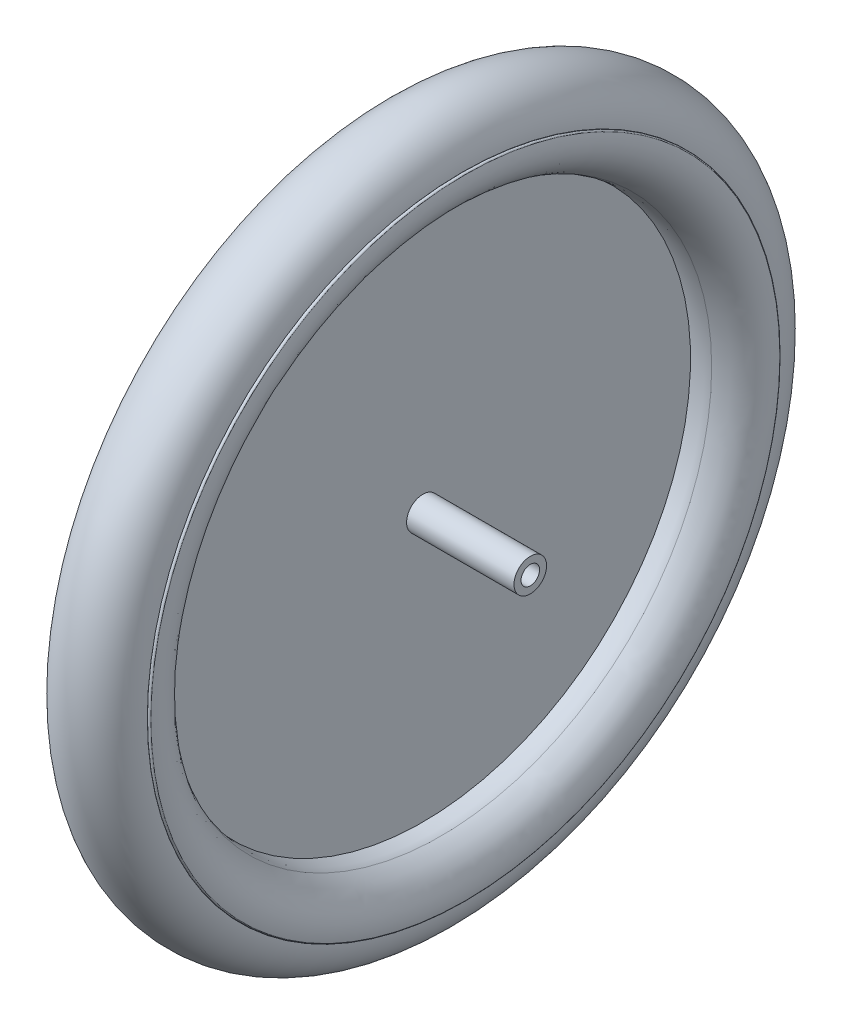
ISO-10303-21;
HEADER;
FILE_DESCRIPTION(('STEP AP214'),'2;1');
FILE_NAME('part.step','',(''),(''),'','','');
FILE_SCHEMA(('AUTOMOTIVE_DESIGN { 1 0 10303 214 1 1 1 1 }'));
ENDSEC;
DATA;
#1=APPLICATION_CONTEXT('core data for automotive mechanical design processes');
#2=APPLICATION_PROTOCOL_DEFINITION('international standard','automotive_design',2000,#1);
#3=PRODUCT_CONTEXT('',#1,'mechanical');
#4=PRODUCT('Part','Part','',(#3));
#5=PRODUCT_RELATED_PRODUCT_CATEGORY('part','',(#4));
#6=PRODUCT_DEFINITION_FORMATION('','',#4);
#7=PRODUCT_DEFINITION_CONTEXT('part definition',#1,'design');
#8=PRODUCT_DEFINITION('design','',#6,#7);
#9=PRODUCT_DEFINITION_SHAPE('','',#8);
#10=(LENGTH_UNIT() NAMED_UNIT(*) SI_UNIT(.MILLI.,.METRE.));
#11=(NAMED_UNIT(*) PLANE_ANGLE_UNIT() SI_UNIT($,.RADIAN.));
#12=(NAMED_UNIT(*) SI_UNIT($,.STERADIAN.) SOLID_ANGLE_UNIT());
#13=UNCERTAINTY_MEASURE_WITH_UNIT(LENGTH_MEASURE(1.E-05),#10,'distance_accuracy_value','');
#14=(GEOMETRIC_REPRESENTATION_CONTEXT(3) GLOBAL_UNCERTAINTY_ASSIGNED_CONTEXT((#13)) GLOBAL_UNIT_ASSIGNED_CONTEXT((#10,
#11,#12)) REPRESENTATION_CONTEXT('',''));
#15=CARTESIAN_POINT('',(0.,0.,0.));
#16=DIRECTION('',(0.,0.,1.));
#17=DIRECTION('',(1.,0.,0.));
#18=AXIS2_PLACEMENT_3D('',#15,#16,#17);
#19=CARTESIAN_POINT('',(-10.6715551842088,146.25842272365,0.));
#20=CARTESIAN_POINT('',(-5.81941817443586,143.971838924294,0.));
#21=CARTESIAN_POINT('',(6.40233055545218,143.852391413271,0.));
#22=CARTESIAN_POINT('',(10.6715551842088,146.25842272365,0.));
#23=B_SPLINE_CURVE_WITH_KNOTS('',3,(#19,#20,#21,#22),.UNSPECIFIED.,.F.,.F.,(4,4),(0.,1.),.UNSPECIFIED.);
#24=CARTESIAN_POINT('',(0.,0.,0.));
#25=DIRECTION('',(-1.,0.,0.));
#26=AXIS1_PLACEMENT('',#24,#25);
#27=SURFACE_OF_REVOLUTION('',#23,#26);
#28=CARTESIAN_POINT('',(-10.6715551842088,0.,0.));
#29=DIRECTION('',(-1.,0.,0.));
#30=DIRECTION('',(0.,0.,1.));
#31=AXIS2_PLACEMENT_3D('',#28,#29,#30);
#32=CIRCLE('',#31,146.25842272365);
#33=CARTESIAN_POINT('',(-10.6715551842088,0.,146.25842272365));
#34=VERTEX_POINT('',#33);
#35=EDGE_CURVE('E118',#34,#34,#32,.T.);
#36=ORIENTED_EDGE('',*,*,#35,.T.);
#37=EDGE_LOOP('',(#36));
#38=FACE_BOUND('',#37,.T.);
#39=CARTESIAN_POINT('',(-0.999999999999999,0.,0.));
#40=DIRECTION('',(-1.,0.,0.));
#41=DIRECTION('',(0.,0.,1.));
#42=AXIS2_PLACEMENT_3D('',#39,#40,#41);
#43=CIRCLE('',#42,144.519472705509);
#44=CARTESIAN_POINT('',(-0.999999999999999,0.,144.519472705509));
#45=VERTEX_POINT('',#44);
#46=EDGE_CURVE('E64',#45,#45,#43,.T.);
#47=ORIENTED_EDGE('',*,*,#46,.F.);
#48=EDGE_LOOP('',(#47));
#49=FACE_BOUND('',#48,.T.);
#50=ADVANCED_FACE('F49',(#38,#49),#27,.T.);
#51=CARTESIAN_POINT('',(-23.0333558812685,0.,0.));
#52=DIRECTION('',(-1.,0.,0.));
#53=DIRECTION('',(0.,0.,1.));
#54=AXIS2_PLACEMENT_3D('',#51,#52,#53);
#55=TOROIDAL_SURFACE('',#54,169.404109047267,0.999999999999989);
#56=CARTESIAN_POINT('',(-23.9668089752368,0.,0.));
#57=DIRECTION('',(-1.,0.,0.));
#58=DIRECTION('',(0.,0.,1.));
#59=AXIS2_PLACEMENT_3D('',#56,#57,#58);
#60=CIRCLE('',#59,169.762808533412);
#61=CARTESIAN_POINT('',(-23.9668089752368,0.,169.762808533412));
#62=VERTEX_POINT('',#61);
#63=EDGE_CURVE('E122',#62,#62,#60,.T.);
#64=ORIENTED_EDGE('',*,*,#63,.F.);
#65=EDGE_LOOP('',(#64));
#66=FACE_BOUND('',#65,.T.);
#67=CARTESIAN_POINT('',(-22.5,0.,0.));
#68=DIRECTION('',(-1.,0.,0.));
#69=DIRECTION('',(0.,0.,1.));
#70=AXIS2_PLACEMENT_3D('',#67,#68,#69);
#71=CIRCLE('',#70,170.25);
#72=CARTESIAN_POINT('',(-22.5,0.,170.25));
#73=VERTEX_POINT('',#72);
#74=EDGE_CURVE('E98',#73,#73,#71,.T.);
#75=ORIENTED_EDGE('',*,*,#74,.T.);
#76=EDGE_LOOP('',(#75));
#77=FACE_BOUND('',#76,.T.);
#78=ADVANCED_FACE('F51',(#66,#77),#55,.T.);
#79=CARTESIAN_POINT('',(-23.9668089752368,169.762808533412,0.));
#80=CARTESIAN_POINT('',(-26.7218299087195,157.734548001136,0.));
#81=CARTESIAN_POINT('',(-18.7837733627974,150.081329337094,0.));
#82=CARTESIAN_POINT('',(-10.6715551842087,146.25842272365,0.));
#83=B_SPLINE_CURVE_WITH_KNOTS('',3,(#79,#80,#81,#82),.UNSPECIFIED.,.F.,.F.,(4,4),(0.,1.),.UNSPECIFIED.);
#84=CARTESIAN_POINT('',(0.,0.,0.));
#85=DIRECTION('',(-1.,0.,0.));
#86=AXIS1_PLACEMENT('',#84,#85);
#87=SURFACE_OF_REVOLUTION('',#83,#86);
#88=ORIENTED_EDGE('',*,*,#35,.F.);
#89=EDGE_LOOP('',(#88));
#90=FACE_BOUND('',#89,.T.);
#91=ORIENTED_EDGE('',*,*,#63,.T.);
#92=EDGE_LOOP('',(#91));
#93=FACE_BOUND('',#92,.T.);
#94=ADVANCED_FACE('F80',(#90,#93),#87,.T.);
#95=CARTESIAN_POINT('',(0.999999999999999,0.,0.));
#96=DIRECTION('',(-1.,0.,0.));
#97=DIRECTION('',(0.,0.,1.));
#98=AXIS2_PLACEMENT_3D('',#95,#96,#97);
#99=CIRCLE('',#98,144.50272225079);
#100=CARTESIAN_POINT('',(0.999999999999999,0.,144.50272225079));
#101=VERTEX_POINT('',#100);
#102=EDGE_CURVE('E106',#101,#101,#99,.T.);
#103=ORIENTED_EDGE('',*,*,#102,.T.);
#104=EDGE_LOOP('',(#103));
#105=FACE_BOUND('',#104,.T.);
#106=CARTESIAN_POINT('',(10.6715551842087,0.,0.));
#107=DIRECTION('',(-1.,0.,0.));
#108=DIRECTION('',(0.,0.,1.));
#109=AXIS2_PLACEMENT_3D('',#106,#107,#108);
#110=CIRCLE('',#109,146.25842272365);
#111=CARTESIAN_POINT('',(10.6715551842087,0.,146.25842272365));
#112=VERTEX_POINT('',#111);
#113=EDGE_CURVE('E114',#112,#112,#110,.T.);
#114=ORIENTED_EDGE('',*,*,#113,.F.);
#115=EDGE_LOOP('',(#114));
#116=FACE_BOUND('',#115,.T.);
#117=ADVANCED_FACE('F83',(#105,#116),#27,.T.);
#118=CARTESIAN_POINT('',(10.6715551842087,146.25842272365,0.));
#119=CARTESIAN_POINT('',(18.7837733627974,150.081329337094,0.));
#120=CARTESIAN_POINT('',(26.7218299087195,157.734548001136,0.));
#121=CARTESIAN_POINT('',(23.9668089752368,169.762808533412,0.));
#122=B_SPLINE_CURVE_WITH_KNOTS('',3,(#118,#119,#120,#121),.UNSPECIFIED.,.F.,.F.,(4,4),(0.,1.),.UNSPECIFIED.);
#123=CARTESIAN_POINT('',(0.,0.,0.));
#124=DIRECTION('',(-1.,0.,0.));
#125=AXIS1_PLACEMENT('',#123,#124);
#126=SURFACE_OF_REVOLUTION('',#122,#125);
#127=CARTESIAN_POINT('',(23.9668089752367,0.,0.));
#128=DIRECTION('',(-1.,0.,0.));
#129=DIRECTION('',(0.,0.,1.));
#130=AXIS2_PLACEMENT_3D('',#127,#128,#129);
#131=CIRCLE('',#130,169.762808533412);
#132=CARTESIAN_POINT('',(23.9668089752367,0.,169.762808533412));
#133=VERTEX_POINT('',#132);
#134=EDGE_CURVE('E110',#133,#133,#131,.T.);
#135=ORIENTED_EDGE('',*,*,#134,.F.);
#136=EDGE_LOOP('',(#135));
#137=FACE_BOUND('',#136,.T.);
#138=ORIENTED_EDGE('',*,*,#113,.T.);
#139=EDGE_LOOP('',(#138));
#140=FACE_BOUND('',#139,.T.);
#141=ADVANCED_FACE('F87',(#137,#140),#126,.T.);
#142=CARTESIAN_POINT('',(23.0333558812685,0.,0.));
#143=DIRECTION('',(-1.,0.,0.));
#144=DIRECTION('',(0.,0.,1.));
#145=AXIS2_PLACEMENT_3D('',#142,#143,#144);
#146=TOROIDAL_SURFACE('',#145,169.404109047267,0.999999999999989);
#147=CARTESIAN_POINT('',(22.5,0.,0.));
#148=DIRECTION('',(-1.,0.,0.));
#149=DIRECTION('',(0.,0.,1.));
#150=AXIS2_PLACEMENT_3D('',#147,#148,#149);
#151=CIRCLE('',#150,170.25);
#152=CARTESIAN_POINT('',(22.5,0.,170.25));
#153=VERTEX_POINT('',#152);
#154=EDGE_CURVE('E105',#153,#153,#151,.T.);
#155=ORIENTED_EDGE('',*,*,#154,.F.);
#156=EDGE_LOOP('',(#155));
#157=FACE_BOUND('',#156,.T.);
#158=ORIENTED_EDGE('',*,*,#134,.T.);
#159=EDGE_LOOP('',(#158));
#160=FACE_BOUND('',#159,.T.);
#161=ADVANCED_FACE('F91',(#157,#160),#146,.T.);
#162=CARTESIAN_POINT('',(0.,0.,0.));
#163=DIRECTION('',(-1.,0.,0.));
#164=DIRECTION('',(0.,0.,1.));
#165=AXIS2_PLACEMENT_3D('',#162,#163,#164);
#166=TOROIDAL_SURFACE('',#165,170.25,22.5);
#167=ORIENTED_EDGE('',*,*,#74,.F.);
#168=EDGE_LOOP('',(#167));
#169=FACE_BOUND('',#168,.T.);
#170=ORIENTED_EDGE('',*,*,#154,.T.);
#171=EDGE_LOOP('',(#170));
#172=FACE_BOUND('',#171,.T.);
#173=ADVANCED_FACE('F147',(#169,#172),#166,.T.);
#174=CARTESIAN_POINT('',(1.,0.,0.));
#175=DIRECTION('',(1.,0.,0.));
#176=DIRECTION('',(0.,0.,-1.));
#177=AXIS2_PLACEMENT_3D('',#174,#175,#176);
#178=PLANE('',#177);
#179=CARTESIAN_POINT('',(1.,0.,0.));
#180=DIRECTION('',(1.,0.,0.));
#181=DIRECTION('',(0.,0.,-1.));
#182=AXIS2_PLACEMENT_3D('',#179,#180,#181);
#183=CIRCLE('',#182,8.8);
#184=CARTESIAN_POINT('',(1.,0.,-8.8));
#185=VERTEX_POINT('',#184);
#186=EDGE_CURVE('E10',#185,#185,#183,.T.);
#187=ORIENTED_EDGE('',*,*,#186,.F.);
#188=EDGE_LOOP('',(#187));
#189=FACE_BOUND('',#188,.T.);
#190=ORIENTED_EDGE('',*,*,#102,.F.);
#191=EDGE_LOOP('',(#190));
#192=FACE_BOUND('',#191,.T.);
#193=ADVANCED_FACE('F150',(#189,#192),#178,.T.);
#194=CARTESIAN_POINT('',(-1.,0.,0.));
#195=DIRECTION('',(1.,0.,0.));
#196=DIRECTION('',(0.,0.,-1.));
#197=AXIS2_PLACEMENT_3D('',#194,#195,#196);
#198=PLANE('',#197);
#199=CARTESIAN_POINT('',(-1.,0.,0.));
#200=DIRECTION('',(1.,0.,0.));
#201=DIRECTION('',(0.,0.,-1.));
#202=AXIS2_PLACEMENT_3D('',#199,#200,#201);
#203=CIRCLE('',#202,8.8);
#204=CARTESIAN_POINT('',(-1.,0.,-8.8));
#205=VERTEX_POINT('',#204);
#206=EDGE_CURVE('E53',#205,#205,#203,.T.);
#207=ORIENTED_EDGE('',*,*,#206,.T.);
#208=EDGE_LOOP('',(#207));
#209=FACE_BOUND('',#208,.T.);
#210=ORIENTED_EDGE('',*,*,#46,.T.);
#211=EDGE_LOOP('',(#210));
#212=FACE_BOUND('',#211,.T.);
#213=ADVANCED_FACE('F133',(#209,#212),#198,.F.);
#214=CARTESIAN_POINT('',(-59.,0.,0.));
#215=DIRECTION('',(1.,0.,0.));
#216=DIRECTION('',(0.,0.,-1.));
#217=AXIS2_PLACEMENT_3D('',#214,#215,#216);
#218=CYLINDRICAL_SURFACE('',#217,8.8);
#219=CARTESIAN_POINT('',(-59.,0.,0.));
#220=DIRECTION('',(1.,0.,0.));
#221=DIRECTION('',(0.,0.,-1.));
#222=AXIS2_PLACEMENT_3D('',#219,#220,#221);
#223=CIRCLE('',#222,8.8);
#224=CARTESIAN_POINT('',(-59.,0.,-8.8));
#225=VERTEX_POINT('',#224);
#226=EDGE_CURVE('E307',#225,#225,#223,.T.);
#227=ORIENTED_EDGE('',*,*,#226,.T.);
#228=EDGE_LOOP('',(#227));
#229=FACE_BOUND('',#228,.T.);
#230=ORIENTED_EDGE('',*,*,#206,.F.);
#231=EDGE_LOOP('',(#230));
#232=FACE_BOUND('',#231,.T.);
#233=ADVANCED_FACE('F217',(#229,#232),#218,.T.);
#234=CARTESIAN_POINT('',(-59.,0.,0.));
#235=DIRECTION('',(1.,0.,0.));
#236=DIRECTION('',(0.,0.,-1.));
#237=AXIS2_PLACEMENT_3D('',#234,#235,#236);
#238=PLANE('',#237);
#239=CARTESIAN_POINT('',(-59.,0.,0.));
#240=DIRECTION('',(1.,0.,0.));
#241=DIRECTION('',(0.,0.,-1.));
#242=AXIS2_PLACEMENT_3D('',#239,#240,#241);
#243=CIRCLE('',#242,5.);
#244=CARTESIAN_POINT('',(-59.,0.,-5.));
#245=VERTEX_POINT('',#244);
#246=EDGE_CURVE('E312',#245,#245,#243,.T.);
#247=ORIENTED_EDGE('',*,*,#246,.T.);
#248=EDGE_LOOP('',(#247));
#249=FACE_BOUND('',#248,.T.);
#250=ORIENTED_EDGE('',*,*,#226,.F.);
#251=EDGE_LOOP('',(#250));
#252=FACE_BOUND('',#251,.T.);
#253=ADVANCED_FACE('F230',(#249,#252),#238,.F.);
#254=CARTESIAN_POINT('',(-59.,0.,0.));
#255=DIRECTION('',(1.,0.,0.));
#256=DIRECTION('',(0.,0.,-1.));
#257=AXIS2_PLACEMENT_3D('',#254,#255,#256);
#258=CYLINDRICAL_SURFACE('',#257,5.);
#259=ORIENTED_EDGE('',*,*,#246,.F.);
#260=EDGE_LOOP('',(#259));
#261=FACE_BOUND('',#260,.T.);
#262=CARTESIAN_POINT('',(-1.,0.,0.));
#263=DIRECTION('',(1.,0.,0.));
#264=DIRECTION('',(0.,0.,-1.));
#265=AXIS2_PLACEMENT_3D('',#262,#263,#264);
#266=CIRCLE('',#265,5.);
#267=CARTESIAN_POINT('',(-1.,0.,-5.));
#268=VERTEX_POINT('',#267);
#269=EDGE_CURVE('E58',#268,#268,#266,.T.);
#270=ORIENTED_EDGE('',*,*,#269,.T.);
#271=EDGE_LOOP('',(#270));
#272=FACE_BOUND('',#271,.T.);
#273=ADVANCED_FACE('F245',(#261,#272),#258,.F.);
#274=ORIENTED_EDGE('',*,*,#269,.F.);
#275=EDGE_LOOP('',(#274));
#276=FACE_BOUND('',#275,.T.);
#277=ADVANCED_FACE('F220',(#276),#198,.F.);
#278=ORIENTED_EDGE('',*,*,#186,.T.);
#279=EDGE_LOOP('',(#278));
#280=FACE_BOUND('',#279,.T.);
#281=CARTESIAN_POINT('',(59.,0.,0.));
#282=DIRECTION('',(1.,0.,0.));
#283=DIRECTION('',(0.,0.,-1.));
#284=AXIS2_PLACEMENT_3D('',#281,#282,#283);
#285=CIRCLE('',#284,8.8);
#286=CARTESIAN_POINT('',(59.,0.,-8.8));
#287=VERTEX_POINT('',#286);
#288=EDGE_CURVE('E316',#287,#287,#285,.T.);
#289=ORIENTED_EDGE('',*,*,#288,.F.);
#290=EDGE_LOOP('',(#289));
#291=FACE_BOUND('',#290,.T.);
#292=ADVANCED_FACE('F233',(#280,#291),#218,.T.);
#293=CARTESIAN_POINT('',(1.,0.,0.));
#294=DIRECTION('',(1.,0.,0.));
#295=DIRECTION('',(0.,0.,-1.));
#296=AXIS2_PLACEMENT_3D('',#293,#294,#295);
#297=CIRCLE('',#296,5.);
#298=CARTESIAN_POINT('',(1.,0.,-5.));
#299=VERTEX_POINT('',#298);
#300=EDGE_CURVE('E67',#299,#299,#297,.T.);
#301=ORIENTED_EDGE('',*,*,#300,.F.);
#302=EDGE_LOOP('',(#301));
#303=FACE_BOUND('',#302,.T.);
#304=CARTESIAN_POINT('',(59.,0.,0.));
#305=DIRECTION('',(1.,0.,0.));
#306=DIRECTION('',(0.,0.,-1.));
#307=AXIS2_PLACEMENT_3D('',#304,#305,#306);
#308=CIRCLE('',#307,5.);
#309=CARTESIAN_POINT('',(59.,0.,-5.));
#310=VERTEX_POINT('',#309);
#311=EDGE_CURVE('E322',#310,#310,#308,.T.);
#312=ORIENTED_EDGE('',*,*,#311,.T.);
#313=EDGE_LOOP('',(#312));
#314=FACE_BOUND('',#313,.T.);
#315=ADVANCED_FACE('F259',(#303,#314),#258,.F.);
#316=CARTESIAN_POINT('',(59.,0.,0.));
#317=DIRECTION('',(1.,0.,0.));
#318=DIRECTION('',(0.,0.,-1.));
#319=AXIS2_PLACEMENT_3D('',#316,#317,#318);
#320=PLANE('',#319);
#321=ORIENTED_EDGE('',*,*,#288,.T.);
#322=EDGE_LOOP('',(#321));
#323=FACE_BOUND('',#322,.T.);
#324=ORIENTED_EDGE('',*,*,#311,.F.);
#325=EDGE_LOOP('',(#324));
#326=FACE_BOUND('',#325,.T.);
#327=ADVANCED_FACE('F281',(#323,#326),#320,.T.);
#328=ORIENTED_EDGE('',*,*,#300,.T.);
#329=EDGE_LOOP('',(#328));
#330=FACE_BOUND('',#329,.T.);
#331=ADVANCED_FACE('F206',(#330),#178,.T.);
#332=CLOSED_SHELL('',(#50,#78,#94,#117,#141,#161,#173,#193,#213,#233,#253,#273,#277,#292,#315,
#327,#331));
#333=MANIFOLD_SOLID_BREP('B2',#332);
#334=ADVANCED_BREP_SHAPE_REPRESENTATION('',(#18,#333),#14);
#335=SHAPE_DEFINITION_REPRESENTATION(#9,#334);
ENDSEC;
END-ISO-10303-21;
